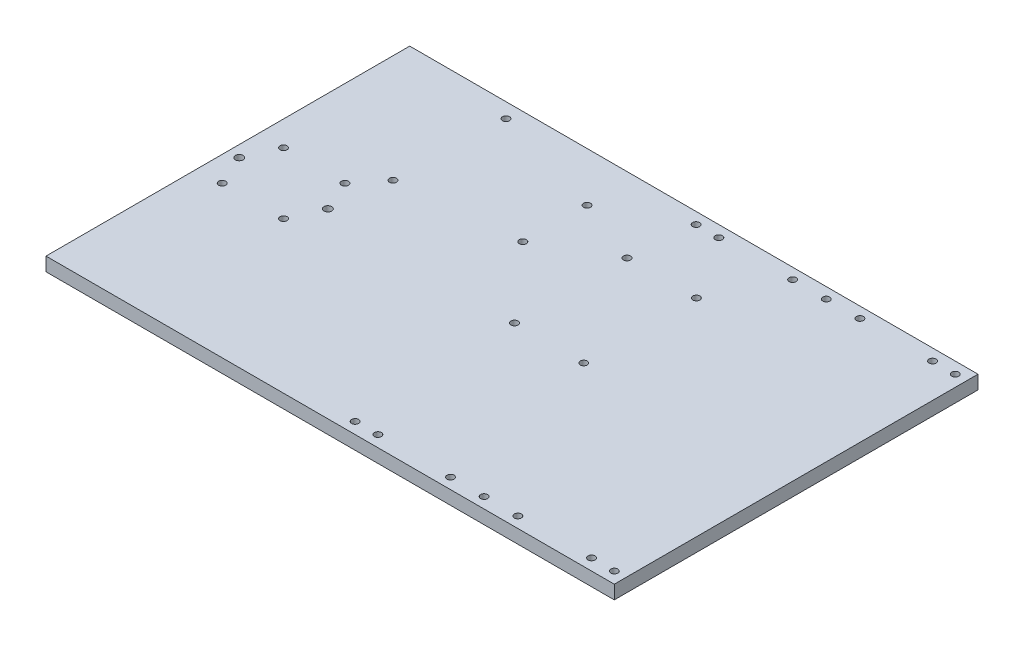
ISO-10303-21;
HEADER;
FILE_DESCRIPTION(('STEP AP214'),'2;1');
FILE_NAME('part.step','',(''),(''),'','','');
FILE_SCHEMA(('AUTOMOTIVE_DESIGN { 1 0 10303 214 1 1 1 1 }'));
ENDSEC;
DATA;
#1=APPLICATION_CONTEXT('core data for automotive mechanical design processes');
#2=APPLICATION_PROTOCOL_DEFINITION('international standard','automotive_design',2000,#1);
#3=PRODUCT_CONTEXT('',#1,'mechanical');
#4=PRODUCT('Part','Part','',(#3));
#5=PRODUCT_RELATED_PRODUCT_CATEGORY('part','',(#4));
#6=PRODUCT_DEFINITION_FORMATION('','',#4);
#7=PRODUCT_DEFINITION_CONTEXT('part definition',#1,'design');
#8=PRODUCT_DEFINITION('design','',#6,#7);
#9=PRODUCT_DEFINITION_SHAPE('','',#8);
#10=(LENGTH_UNIT() NAMED_UNIT(*) SI_UNIT(.MILLI.,.METRE.));
#11=(NAMED_UNIT(*) PLANE_ANGLE_UNIT() SI_UNIT($,.RADIAN.));
#12=(NAMED_UNIT(*) SI_UNIT($,.STERADIAN.) SOLID_ANGLE_UNIT());
#13=UNCERTAINTY_MEASURE_WITH_UNIT(LENGTH_MEASURE(1.E-05),#10,'distance_accuracy_value','');
#14=(GEOMETRIC_REPRESENTATION_CONTEXT(3) GLOBAL_UNCERTAINTY_ASSIGNED_CONTEXT((#13)) GLOBAL_UNIT_ASSIGNED_CONTEXT((#10,
#11,#12)) REPRESENTATION_CONTEXT('',''));
#15=CARTESIAN_POINT('',(0.,0.,0.));
#16=DIRECTION('',(0.,0.,1.));
#17=DIRECTION('',(1.,0.,0.));
#18=AXIS2_PLACEMENT_3D('',#15,#16,#17);
#19=CARTESIAN_POINT('',(0.,0.,0.));
#20=DIRECTION('',(0.,-1.,0.));
#21=DIRECTION('',(0.,0.,-1.));
#22=AXIS2_PLACEMENT_3D('',#19,#20,#21);
#23=PLANE('',#22);
#24=CARTESIAN_POINT('',(-80.9999999999999,0.,8.2572837456496E-13));
#25=DIRECTION('',(0.,-1.,0.));
#26=DIRECTION('',(0.,0.,-1.));
#27=AXIS2_PLACEMENT_3D('',#24,#25,#26);
#28=CIRCLE('',#27,1.69999999999999);
#29=CARTESIAN_POINT('',(-80.9999999999999,0.,-1.69999999999917));
#30=VERTEX_POINT('',#29);
#31=EDGE_CURVE('E275',#30,#30,#28,.T.);
#32=ORIENTED_EDGE('',*,*,#31,.F.);
#33=EDGE_LOOP('',(#32));
#34=FACE_BOUND('',#33,.T.);
#35=CARTESIAN_POINT('',(-120.,0.,9.64506252643105E-13));
#36=DIRECTION('',(0.,-1.,0.));
#37=DIRECTION('',(0.,0.,-1.));
#38=AXIS2_PLACEMENT_3D('',#35,#36,#37);
#39=CIRCLE('',#38,1.69999999999999);
#40=CARTESIAN_POINT('',(-120.,0.,-1.69999999999903));
#41=VERTEX_POINT('',#40);
#42=EDGE_CURVE('E269',#41,#41,#39,.T.);
#43=ORIENTED_EDGE('',*,*,#42,.F.);
#44=EDGE_LOOP('',(#43));
#45=FACE_BOUND('',#44,.T.);
#46=CARTESIAN_POINT('',(3.53999999999995,0.,2.46000000000128));
#47=DIRECTION('',(0.,1.,0.));
#48=DIRECTION('',(0.,0.,1.));
#49=AXIS2_PLACEMENT_3D('',#46,#47,#48);
#50=CIRCLE('',#49,1.55);
#51=CARTESIAN_POINT('',(3.53999999999995,0.,4.01000000000128));
#52=VERTEX_POINT('',#51);
#53=EDGE_CURVE('E260',#52,#52,#50,.T.);
#54=ORIENTED_EDGE('',*,*,#53,.T.);
#55=EDGE_LOOP('',(#54));
#56=FACE_BOUND('',#55,.T.);
#57=CARTESIAN_POINT('',(34.02,0.,2.46000000000127));
#58=DIRECTION('',(0.,1.,0.));
#59=DIRECTION('',(0.,0.,1.));
#60=AXIS2_PLACEMENT_3D('',#57,#58,#59);
#61=CIRCLE('',#60,1.55);
#62=CARTESIAN_POINT('',(34.02,0.,4.01000000000127));
#63=VERTEX_POINT('',#62);
#64=EDGE_CURVE('E254',#63,#63,#61,.T.);
#65=ORIENTED_EDGE('',*,*,#64,.T.);
#66=EDGE_LOOP('',(#65));
#67=FACE_BOUND('',#66,.T.);
#68=CARTESIAN_POINT('',(34.0199999999999,0.,-47.0699999999987));
#69=DIRECTION('',(0.,1.,0.));
#70=DIRECTION('',(0.,0.,1.));
#71=AXIS2_PLACEMENT_3D('',#68,#69,#70);
#72=CIRCLE('',#71,1.55);
#73=CARTESIAN_POINT('',(34.0199999999999,0.,-45.5199999999987));
#74=VERTEX_POINT('',#73);
#75=EDGE_CURVE('E248',#74,#74,#72,.T.);
#76=ORIENTED_EDGE('',*,*,#75,.T.);
#77=EDGE_LOOP('',(#76));
#78=FACE_BOUND('',#77,.T.);
#79=CARTESIAN_POINT('',(3.53999999999995,0.,-47.0699999999987));
#80=DIRECTION('',(0.,1.,0.));
#81=DIRECTION('',(0.,0.,1.));
#82=AXIS2_PLACEMENT_3D('',#79,#80,#81);
#83=CIRCLE('',#82,1.55);
#84=CARTESIAN_POINT('',(3.53999999999995,0.,-45.5199999999987));
#85=VERTEX_POINT('',#84);
#86=EDGE_CURVE('E242',#85,#85,#83,.T.);
#87=ORIENTED_EDGE('',*,*,#86,.T.);
#88=EDGE_LOOP('',(#87));
#89=FACE_BOUND('',#88,.T.);
#90=CARTESIAN_POINT('',(-77.56,0.,-25.209));
#91=DIRECTION('',(0.,1.,0.));
#92=DIRECTION('',(0.,0.,1.));
#93=AXIS2_PLACEMENT_3D('',#90,#91,#92);
#94=CIRCLE('',#93,1.55);
#95=CARTESIAN_POINT('',(-77.56,0.,-23.659));
#96=VERTEX_POINT('',#95);
#97=EDGE_CURVE('E236',#96,#96,#94,.T.);
#98=ORIENTED_EDGE('',*,*,#97,.T.);
#99=EDGE_LOOP('',(#98));
#100=FACE_BOUND('',#99,.T.);
#101=CARTESIAN_POINT('',(-25.5900000000001,0.,-30.359));
#102=DIRECTION('',(0.,1.,0.));
#103=DIRECTION('',(0.,0.,1.));
#104=AXIS2_PLACEMENT_3D('',#101,#102,#103);
#105=CIRCLE('',#104,1.55);
#106=CARTESIAN_POINT('',(-25.5900000000001,0.,-28.809));
#107=VERTEX_POINT('',#106);
#108=EDGE_CURVE('E230',#107,#107,#105,.T.);
#109=ORIENTED_EDGE('',*,*,#108,.T.);
#110=EDGE_LOOP('',(#109));
#111=FACE_BOUND('',#110,.T.);
#112=CARTESIAN_POINT('',(-25.36,0.,-58.359));
#113=DIRECTION('',(0.,1.,0.));
#114=DIRECTION('',(0.,0.,1.));
#115=AXIS2_PLACEMENT_3D('',#112,#113,#114);
#116=CIRCLE('',#115,1.55);
#117=CARTESIAN_POINT('',(-25.36,0.,-56.809));
#118=VERTEX_POINT('',#117);
#119=EDGE_CURVE('E224',#118,#118,#116,.T.);
#120=ORIENTED_EDGE('',*,*,#119,.T.);
#121=EDGE_LOOP('',(#120));
#122=FACE_BOUND('',#121,.T.);
#123=CARTESIAN_POINT('',(-76.16,0.,-73.509));
#124=DIRECTION('',(0.,1.,0.));
#125=DIRECTION('',(0.,0.,1.));
#126=AXIS2_PLACEMENT_3D('',#123,#124,#125);
#127=CIRCLE('',#126,1.55);
#128=CARTESIAN_POINT('',(-76.16,0.,-71.959));
#129=VERTEX_POINT('',#128);
#130=EDGE_CURVE('E218',#129,#129,#127,.T.);
#131=ORIENTED_EDGE('',*,*,#130,.T.);
#132=EDGE_LOOP('',(#131));
#133=FACE_BOUND('',#132,.T.);
#134=CARTESIAN_POINT('',(-114.,0.,13.5000000000009));
#135=DIRECTION('',(0.,1.,0.));
#136=DIRECTION('',(0.,0.,1.));
#137=AXIS2_PLACEMENT_3D('',#134,#135,#136);
#138=CIRCLE('',#137,1.55);
#139=CARTESIAN_POINT('',(-114.,0.,15.0500000000009));
#140=VERTEX_POINT('',#139);
#141=EDGE_CURVE('E212',#140,#140,#138,.T.);
#142=ORIENTED_EDGE('',*,*,#141,.T.);
#143=EDGE_LOOP('',(#142));
#144=FACE_BOUND('',#143,.T.);
#145=CARTESIAN_POINT('',(-86.9999999999999,0.,13.5000000000009));
#146=DIRECTION('',(0.,1.,0.));
#147=DIRECTION('',(0.,0.,1.));
#148=AXIS2_PLACEMENT_3D('',#145,#146,#147);
#149=CIRCLE('',#148,1.55);
#150=CARTESIAN_POINT('',(-86.9999999999999,0.,15.0500000000009));
#151=VERTEX_POINT('',#150);
#152=EDGE_CURVE('E206',#151,#151,#149,.T.);
#153=ORIENTED_EDGE('',*,*,#152,.T.);
#154=EDGE_LOOP('',(#153));
#155=FACE_BOUND('',#154,.T.);
#156=CARTESIAN_POINT('',(-86.9999999999999,0.,-13.4999999999992));
#157=DIRECTION('',(0.,1.,0.));
#158=DIRECTION('',(0.,0.,1.));
#159=AXIS2_PLACEMENT_3D('',#156,#157,#158);
#160=CIRCLE('',#159,1.55);
#161=CARTESIAN_POINT('',(-86.9999999999999,0.,-11.9499999999992));
#162=VERTEX_POINT('',#161);
#163=EDGE_CURVE('E200',#162,#162,#160,.T.);
#164=ORIENTED_EDGE('',*,*,#163,.T.);
#165=EDGE_LOOP('',(#164));
#166=FACE_BOUND('',#165,.T.);
#167=DIRECTION('',(0.,0.,-1.));
#168=VECTOR('',#167,1.);
#169=CARTESIAN_POINT('',(125.,0.,80.));
#170=LINE('',#169,#168);
#171=CARTESIAN_POINT('',(125.,0.,80.));
#172=VERTEX_POINT('',#171);
#173=CARTESIAN_POINT('',(125.,0.,-80.));
#174=VERTEX_POINT('',#173);
#175=EDGE_CURVE('E97',#172,#174,#170,.T.);
#176=ORIENTED_EDGE('',*,*,#175,.F.);
#177=DIRECTION('',(1.,0.,0.));
#178=VECTOR('',#177,1.);
#179=CARTESIAN_POINT('',(-125.,0.,80.));
#180=LINE('',#179,#178);
#181=CARTESIAN_POINT('',(-125.,0.,80.));
#182=VERTEX_POINT('',#181);
#183=EDGE_CURVE('E73',#182,#172,#180,.T.);
#184=ORIENTED_EDGE('',*,*,#183,.F.);
#185=DIRECTION('',(0.,0.,1.));
#186=VECTOR('',#185,1.);
#187=CARTESIAN_POINT('',(-125.,0.,80.));
#188=LINE('',#187,#186);
#189=CARTESIAN_POINT('',(-125.,0.,-80.));
#190=VERTEX_POINT('',#189);
#191=EDGE_CURVE('E67',#190,#182,#188,.T.);
#192=ORIENTED_EDGE('',*,*,#191,.F.);
#193=DIRECTION('',(-1.,0.,0.));
#194=VECTOR('',#193,1.);
#195=CARTESIAN_POINT('',(-125.,0.,-80.));
#196=LINE('',#195,#194);
#197=EDGE_CURVE('E89',#174,#190,#196,.T.);
#198=ORIENTED_EDGE('',*,*,#197,.F.);
#199=EDGE_LOOP('',(#176,#184,#192,#198));
#200=FACE_BOUND('',#199,.T.);
#201=CARTESIAN_POINT('',(5.99999999991924,0.,-75.0000000000015));
#202=DIRECTION('',(0.,1.,0.));
#203=DIRECTION('',(0.,0.,1.));
#204=AXIS2_PLACEMENT_3D('',#201,#202,#203);
#205=CIRCLE('',#204,1.55);
#206=CARTESIAN_POINT('',(5.99999999991924,0.,-73.4500000000015));
#207=VERTEX_POINT('',#206);
#208=EDGE_CURVE('E100',#207,#207,#205,.T.);
#209=ORIENTED_EDGE('',*,*,#208,.T.);
#210=EDGE_LOOP('',(#209));
#211=FACE_BOUND('',#210,.T.);
#212=CARTESIAN_POINT('',(15.9999999999192,0.,-75.0000000000015));
#213=DIRECTION('',(0.,1.,0.));
#214=DIRECTION('',(0.,0.,1.));
#215=AXIS2_PLACEMENT_3D('',#212,#213,#214);
#216=CIRCLE('',#215,1.55);
#217=CARTESIAN_POINT('',(15.9999999999192,0.,-73.4500000000015));
#218=VERTEX_POINT('',#217);
#219=EDGE_CURVE('E116',#218,#218,#216,.T.);
#220=ORIENTED_EDGE('',*,*,#219,.T.);
#221=EDGE_LOOP('',(#220));
#222=FACE_BOUND('',#221,.T.);
#223=CARTESIAN_POINT('',(110.,0.,-75.0000000000015));
#224=DIRECTION('',(0.,1.,0.));
#225=DIRECTION('',(0.,0.,1.));
#226=AXIS2_PLACEMENT_3D('',#223,#224,#225);
#227=CIRCLE('',#226,1.55);
#228=CARTESIAN_POINT('',(110.,0.,-73.4500000000015));
#229=VERTEX_POINT('',#228);
#230=EDGE_CURVE('E122',#229,#229,#227,.T.);
#231=ORIENTED_EDGE('',*,*,#230,.T.);
#232=EDGE_LOOP('',(#231));
#233=FACE_BOUND('',#232,.T.);
#234=CARTESIAN_POINT('',(120.,0.,-75.0000000000015));
#235=DIRECTION('',(0.,1.,0.));
#236=DIRECTION('',(0.,0.,1.));
#237=AXIS2_PLACEMENT_3D('',#234,#235,#236);
#238=CIRCLE('',#237,1.55);
#239=CARTESIAN_POINT('',(120.,0.,-73.4500000000015));
#240=VERTEX_POINT('',#239);
#241=EDGE_CURVE('E128',#240,#240,#238,.T.);
#242=ORIENTED_EDGE('',*,*,#241,.T.);
#243=EDGE_LOOP('',(#242));
#244=FACE_BOUND('',#243,.T.);
#245=CARTESIAN_POINT('',(120.,0.,75.));
#246=DIRECTION('',(0.,1.,0.));
#247=DIRECTION('',(0.,0.,1.));
#248=AXIS2_PLACEMENT_3D('',#245,#246,#247);
#249=CIRCLE('',#248,1.55);
#250=CARTESIAN_POINT('',(120.,0.,76.55));
#251=VERTEX_POINT('',#250);
#252=EDGE_CURVE('E134',#251,#251,#249,.T.);
#253=ORIENTED_EDGE('',*,*,#252,.T.);
#254=EDGE_LOOP('',(#253));
#255=FACE_BOUND('',#254,.T.);
#256=CARTESIAN_POINT('',(110.,0.,75.));
#257=DIRECTION('',(0.,1.,0.));
#258=DIRECTION('',(0.,0.,1.));
#259=AXIS2_PLACEMENT_3D('',#256,#257,#258);
#260=CIRCLE('',#259,1.55);
#261=CARTESIAN_POINT('',(110.,0.,76.55));
#262=VERTEX_POINT('',#261);
#263=EDGE_CURVE('E140',#262,#262,#260,.T.);
#264=ORIENTED_EDGE('',*,*,#263,.T.);
#265=EDGE_LOOP('',(#264));
#266=FACE_BOUND('',#265,.T.);
#267=CARTESIAN_POINT('',(15.9999999999192,0.,75.));
#268=DIRECTION('',(0.,1.,0.));
#269=DIRECTION('',(0.,0.,1.));
#270=AXIS2_PLACEMENT_3D('',#267,#268,#269);
#271=CIRCLE('',#270,1.55);
#272=CARTESIAN_POINT('',(15.9999999999192,0.,76.55));
#273=VERTEX_POINT('',#272);
#274=EDGE_CURVE('E146',#273,#273,#271,.T.);
#275=ORIENTED_EDGE('',*,*,#274,.T.);
#276=EDGE_LOOP('',(#275));
#277=FACE_BOUND('',#276,.T.);
#278=CARTESIAN_POINT('',(5.99999999991921,0.,75.));
#279=DIRECTION('',(0.,1.,0.));
#280=DIRECTION('',(0.,0.,1.));
#281=AXIS2_PLACEMENT_3D('',#278,#279,#280);
#282=CIRCLE('',#281,1.55);
#283=CARTESIAN_POINT('',(5.99999999991921,0.,76.55));
#284=VERTEX_POINT('',#283);
#285=EDGE_CURVE('E152',#284,#284,#282,.T.);
#286=ORIENTED_EDGE('',*,*,#285,.T.);
#287=EDGE_LOOP('',(#286));
#288=FACE_BOUND('',#287,.T.);
#289=CARTESIAN_POINT('',(77.7999999999992,0.,75.2499999999985));
#290=DIRECTION('',(0.,1.,0.));
#291=DIRECTION('',(0.,0.,1.));
#292=AXIS2_PLACEMENT_3D('',#289,#290,#291);
#293=CIRCLE('',#292,1.55);
#294=CARTESIAN_POINT('',(77.7999999999992,0.,76.7999999999984));
#295=VERTEX_POINT('',#294);
#296=EDGE_CURVE('E158',#295,#295,#293,.T.);
#297=ORIENTED_EDGE('',*,*,#296,.T.);
#298=EDGE_LOOP('',(#297));
#299=FACE_BOUND('',#298,.T.);
#300=CARTESIAN_POINT('',(62.9999999999999,0.,75.25));
#301=DIRECTION('',(0.,1.,0.));
#302=DIRECTION('',(0.,0.,1.));
#303=AXIS2_PLACEMENT_3D('',#300,#301,#302);
#304=CIRCLE('',#303,1.55);
#305=CARTESIAN_POINT('',(62.9999999999999,0.,76.8));
#306=VERTEX_POINT('',#305);
#307=EDGE_CURVE('E164',#306,#306,#304,.T.);
#308=ORIENTED_EDGE('',*,*,#307,.T.);
#309=EDGE_LOOP('',(#308));
#310=FACE_BOUND('',#309,.T.);
#311=CARTESIAN_POINT('',(48.1999999999999,0.,75.25));
#312=DIRECTION('',(0.,1.,0.));
#313=DIRECTION('',(0.,0.,1.));
#314=AXIS2_PLACEMENT_3D('',#311,#312,#313);
#315=CIRCLE('',#314,1.55);
#316=CARTESIAN_POINT('',(48.1999999999999,0.,76.8));
#317=VERTEX_POINT('',#316);
#318=EDGE_CURVE('E170',#317,#317,#315,.T.);
#319=ORIENTED_EDGE('',*,*,#318,.T.);
#320=EDGE_LOOP('',(#319));
#321=FACE_BOUND('',#320,.T.);
#322=CARTESIAN_POINT('',(77.7999995403885,0.,-75.2500014025759));
#323=DIRECTION('',(0.,1.,0.));
#324=DIRECTION('',(0.,0.,1.));
#325=AXIS2_PLACEMENT_3D('',#322,#323,#324);
#326=CIRCLE('',#325,1.55);
#327=CARTESIAN_POINT('',(77.7999995403885,0.,-73.7000014025759));
#328=VERTEX_POINT('',#327);
#329=EDGE_CURVE('E176',#328,#328,#326,.T.);
#330=ORIENTED_EDGE('',*,*,#329,.T.);
#331=EDGE_LOOP('',(#330));
#332=FACE_BOUND('',#331,.T.);
#333=CARTESIAN_POINT('',(62.9999995403885,0.,-75.2500014025759));
#334=DIRECTION('',(0.,1.,0.));
#335=DIRECTION('',(0.,0.,1.));
#336=AXIS2_PLACEMENT_3D('',#333,#334,#335);
#337=CIRCLE('',#336,1.55);
#338=CARTESIAN_POINT('',(62.9999995403885,0.,-73.7000014025759));
#339=VERTEX_POINT('',#338);
#340=EDGE_CURVE('E182',#339,#339,#337,.T.);
#341=ORIENTED_EDGE('',*,*,#340,.T.);
#342=EDGE_LOOP('',(#341));
#343=FACE_BOUND('',#342,.T.);
#344=CARTESIAN_POINT('',(48.1999995403885,0.,-75.2500014025759));
#345=DIRECTION('',(0.,1.,0.));
#346=DIRECTION('',(0.,0.,1.));
#347=AXIS2_PLACEMENT_3D('',#344,#345,#346);
#348=CIRCLE('',#347,1.55);
#349=CARTESIAN_POINT('',(48.1999995403885,0.,-73.7000014025759));
#350=VERTEX_POINT('',#349);
#351=EDGE_CURVE('E188',#350,#350,#348,.T.);
#352=ORIENTED_EDGE('',*,*,#351,.T.);
#353=EDGE_LOOP('',(#352));
#354=FACE_BOUND('',#353,.T.);
#355=CARTESIAN_POINT('',(-114.,0.,-13.4999999999992));
#356=DIRECTION('',(0.,1.,0.));
#357=DIRECTION('',(0.,0.,1.));
#358=AXIS2_PLACEMENT_3D('',#355,#356,#357);
#359=CIRCLE('',#358,1.55);
#360=CARTESIAN_POINT('',(-114.,0.,-11.9499999999992));
#361=VERTEX_POINT('',#360);
#362=EDGE_CURVE('E194',#361,#361,#359,.T.);
#363=ORIENTED_EDGE('',*,*,#362,.T.);
#364=EDGE_LOOP('',(#363));
#365=FACE_BOUND('',#364,.T.);
#366=ADVANCED_FACE('F33',(#34,#45,#56,#67,#78,#89,#100,#111,#122,#133,#144,#155,#166,#200,#211,
#222,#233,#244,#255,#266,#277,#288,#299,#310,#321,#332,#343,#354,#365),#23,.T.);
#367=CARTESIAN_POINT('',(125.,6.,80.));
#368=DIRECTION('',(-1.,0.,0.));
#369=DIRECTION('',(0.,0.,1.));
#370=AXIS2_PLACEMENT_3D('',#367,#368,#369);
#371=PLANE('',#370);
#372=ORIENTED_EDGE('',*,*,#175,.T.);
#373=DIRECTION('',(0.,-1.,0.));
#374=VECTOR('',#373,1.);
#375=CARTESIAN_POINT('',(125.,6.,-80.));
#376=LINE('',#375,#374);
#377=CARTESIAN_POINT('',(125.,6.,-80.));
#378=VERTEX_POINT('',#377);
#379=EDGE_CURVE('E11',#378,#174,#376,.T.);
#380=ORIENTED_EDGE('',*,*,#379,.F.);
#381=DIRECTION('',(0.,0.,-1.));
#382=VECTOR('',#381,1.);
#383=CARTESIAN_POINT('',(125.,6.,80.));
#384=LINE('',#383,#382);
#385=CARTESIAN_POINT('',(125.,6.,80.));
#386=VERTEX_POINT('',#385);
#387=EDGE_CURVE('E85',#386,#378,#384,.T.);
#388=ORIENTED_EDGE('',*,*,#387,.F.);
#389=DIRECTION('',(0.,-1.,0.));
#390=VECTOR('',#389,1.);
#391=CARTESIAN_POINT('',(125.,6.,80.));
#392=LINE('',#391,#390);
#393=EDGE_CURVE('E93',#386,#172,#392,.T.);
#394=ORIENTED_EDGE('',*,*,#393,.T.);
#395=EDGE_LOOP('',(#372,#380,#388,#394));
#396=FACE_BOUND('',#395,.T.);
#397=ADVANCED_FACE('F35',(#396),#371,.F.);
#398=CARTESIAN_POINT('',(-125.,6.,-80.));
#399=DIRECTION('',(0.,0.,1.));
#400=DIRECTION('',(1.,0.,0.));
#401=AXIS2_PLACEMENT_3D('',#398,#399,#400);
#402=PLANE('',#401);
#403=ORIENTED_EDGE('',*,*,#197,.T.);
#404=DIRECTION('',(0.,-1.,0.));
#405=VECTOR('',#404,1.);
#406=CARTESIAN_POINT('',(-125.,6.,-80.));
#407=LINE('',#406,#405);
#408=CARTESIAN_POINT('',(-125.,6.,-80.));
#409=VERTEX_POINT('',#408);
#410=EDGE_CURVE('E42',#409,#190,#407,.T.);
#411=ORIENTED_EDGE('',*,*,#410,.F.);
#412=DIRECTION('',(-1.,0.,0.));
#413=VECTOR('',#412,1.);
#414=CARTESIAN_POINT('',(-125.,6.,-80.));
#415=LINE('',#414,#413);
#416=EDGE_CURVE('E80',#378,#409,#415,.T.);
#417=ORIENTED_EDGE('',*,*,#416,.F.);
#418=ORIENTED_EDGE('',*,*,#379,.T.);
#419=EDGE_LOOP('',(#403,#411,#417,#418));
#420=FACE_BOUND('',#419,.T.);
#421=ADVANCED_FACE('F88',(#420),#402,.F.);
#422=CARTESIAN_POINT('',(-125.,6.,80.));
#423=DIRECTION('',(1.,0.,0.));
#424=DIRECTION('',(0.,0.,-1.));
#425=AXIS2_PLACEMENT_3D('',#422,#423,#424);
#426=PLANE('',#425);
#427=ORIENTED_EDGE('',*,*,#191,.T.);
#428=DIRECTION('',(0.,-1.,0.));
#429=VECTOR('',#428,1.);
#430=CARTESIAN_POINT('',(-125.,6.,80.));
#431=LINE('',#430,#429);
#432=CARTESIAN_POINT('',(-125.,6.,80.));
#433=VERTEX_POINT('',#432);
#434=EDGE_CURVE('E90',#433,#182,#431,.T.);
#435=ORIENTED_EDGE('',*,*,#434,.F.);
#436=DIRECTION('',(0.,0.,1.));
#437=VECTOR('',#436,1.);
#438=CARTESIAN_POINT('',(-125.,6.,80.));
#439=LINE('',#438,#437);
#440=EDGE_CURVE('E83',#409,#433,#439,.T.);
#441=ORIENTED_EDGE('',*,*,#440,.F.);
#442=ORIENTED_EDGE('',*,*,#410,.T.);
#443=EDGE_LOOP('',(#427,#435,#441,#442));
#444=FACE_BOUND('',#443,.T.);
#445=ADVANCED_FACE('F91',(#444),#426,.F.);
#446=CARTESIAN_POINT('',(-125.,6.,80.));
#447=DIRECTION('',(0.,0.,-1.));
#448=DIRECTION('',(-1.,0.,0.));
#449=AXIS2_PLACEMENT_3D('',#446,#447,#448);
#450=PLANE('',#449);
#451=ORIENTED_EDGE('',*,*,#183,.T.);
#452=ORIENTED_EDGE('',*,*,#393,.F.);
#453=DIRECTION('',(1.,0.,0.));
#454=VECTOR('',#453,1.);
#455=CARTESIAN_POINT('',(-125.,6.,80.));
#456=LINE('',#455,#454);
#457=EDGE_CURVE('E50',#433,#386,#456,.T.);
#458=ORIENTED_EDGE('',*,*,#457,.F.);
#459=ORIENTED_EDGE('',*,*,#434,.T.);
#460=EDGE_LOOP('',(#451,#452,#458,#459));
#461=FACE_BOUND('',#460,.T.);
#462=ADVANCED_FACE('F105',(#461),#450,.F.);
#463=CARTESIAN_POINT('',(0.,6.,0.));
#464=DIRECTION('',(0.,-1.,0.));
#465=DIRECTION('',(0.,0.,-1.));
#466=AXIS2_PLACEMENT_3D('',#463,#464,#465);
#467=PLANE('',#466);
#468=CARTESIAN_POINT('',(-80.9999999999999,6.00000000000001,8.2572837456496E-13));
#469=DIRECTION('',(0.,-1.,0.));
#470=DIRECTION('',(0.,0.,-1.));
#471=AXIS2_PLACEMENT_3D('',#468,#469,#470);
#472=CIRCLE('',#471,1.69999999999999);
#473=CARTESIAN_POINT('',(-80.9999999999999,6.00000000000001,-1.69999999999917));
#474=VERTEX_POINT('',#473);
#475=EDGE_CURVE('E272',#474,#474,#472,.T.);
#476=ORIENTED_EDGE('',*,*,#475,.T.);
#477=EDGE_LOOP('',(#476));
#478=FACE_BOUND('',#477,.T.);
#479=CARTESIAN_POINT('',(-120.,6.00000000000001,9.64506252643105E-13));
#480=DIRECTION('',(0.,-1.,0.));
#481=DIRECTION('',(0.,0.,-1.));
#482=AXIS2_PLACEMENT_3D('',#479,#480,#481);
#483=CIRCLE('',#482,1.69999999999999);
#484=CARTESIAN_POINT('',(-120.,6.00000000000001,-1.69999999999903));
#485=VERTEX_POINT('',#484);
#486=EDGE_CURVE('E266',#485,#485,#483,.T.);
#487=ORIENTED_EDGE('',*,*,#486,.T.);
#488=EDGE_LOOP('',(#487));
#489=FACE_BOUND('',#488,.T.);
#490=CARTESIAN_POINT('',(3.53999999999995,6.,2.46000000000128));
#491=DIRECTION('',(0.,1.,0.));
#492=DIRECTION('',(0.,0.,1.));
#493=AXIS2_PLACEMENT_3D('',#490,#491,#492);
#494=CIRCLE('',#493,1.55);
#495=CARTESIAN_POINT('',(3.53999999999995,6.,4.01000000000128));
#496=VERTEX_POINT('',#495);
#497=EDGE_CURVE('E263',#496,#496,#494,.T.);
#498=ORIENTED_EDGE('',*,*,#497,.F.);
#499=EDGE_LOOP('',(#498));
#500=FACE_BOUND('',#499,.T.);
#501=CARTESIAN_POINT('',(34.02,6.,2.46000000000127));
#502=DIRECTION('',(0.,1.,0.));
#503=DIRECTION('',(0.,0.,1.));
#504=AXIS2_PLACEMENT_3D('',#501,#502,#503);
#505=CIRCLE('',#504,1.55);
#506=CARTESIAN_POINT('',(34.02,6.,4.01000000000127));
#507=VERTEX_POINT('',#506);
#508=EDGE_CURVE('E257',#507,#507,#505,.T.);
#509=ORIENTED_EDGE('',*,*,#508,.F.);
#510=EDGE_LOOP('',(#509));
#511=FACE_BOUND('',#510,.T.);
#512=CARTESIAN_POINT('',(34.0199999999999,6.,-47.0699999999987));
#513=DIRECTION('',(0.,1.,0.));
#514=DIRECTION('',(0.,0.,1.));
#515=AXIS2_PLACEMENT_3D('',#512,#513,#514);
#516=CIRCLE('',#515,1.55);
#517=CARTESIAN_POINT('',(34.0199999999999,6.,-45.5199999999987));
#518=VERTEX_POINT('',#517);
#519=EDGE_CURVE('E251',#518,#518,#516,.T.);
#520=ORIENTED_EDGE('',*,*,#519,.F.);
#521=EDGE_LOOP('',(#520));
#522=FACE_BOUND('',#521,.T.);
#523=CARTESIAN_POINT('',(3.53999999999995,6.,-47.0699999999987));
#524=DIRECTION('',(0.,1.,0.));
#525=DIRECTION('',(0.,0.,1.));
#526=AXIS2_PLACEMENT_3D('',#523,#524,#525);
#527=CIRCLE('',#526,1.55);
#528=CARTESIAN_POINT('',(3.53999999999995,6.,-45.5199999999987));
#529=VERTEX_POINT('',#528);
#530=EDGE_CURVE('E245',#529,#529,#527,.T.);
#531=ORIENTED_EDGE('',*,*,#530,.F.);
#532=EDGE_LOOP('',(#531));
#533=FACE_BOUND('',#532,.T.);
#534=CARTESIAN_POINT('',(-77.56,6.,-25.209));
#535=DIRECTION('',(0.,1.,0.));
#536=DIRECTION('',(0.,0.,1.));
#537=AXIS2_PLACEMENT_3D('',#534,#535,#536);
#538=CIRCLE('',#537,1.55);
#539=CARTESIAN_POINT('',(-77.56,6.,-23.659));
#540=VERTEX_POINT('',#539);
#541=EDGE_CURVE('E239',#540,#540,#538,.T.);
#542=ORIENTED_EDGE('',*,*,#541,.F.);
#543=EDGE_LOOP('',(#542));
#544=FACE_BOUND('',#543,.T.);
#545=CARTESIAN_POINT('',(-25.5900000000001,6.,-30.359));
#546=DIRECTION('',(0.,1.,0.));
#547=DIRECTION('',(0.,0.,1.));
#548=AXIS2_PLACEMENT_3D('',#545,#546,#547);
#549=CIRCLE('',#548,1.55);
#550=CARTESIAN_POINT('',(-25.5900000000001,6.,-28.809));
#551=VERTEX_POINT('',#550);
#552=EDGE_CURVE('E233',#551,#551,#549,.T.);
#553=ORIENTED_EDGE('',*,*,#552,.F.);
#554=EDGE_LOOP('',(#553));
#555=FACE_BOUND('',#554,.T.);
#556=CARTESIAN_POINT('',(-25.36,6.,-58.359));
#557=DIRECTION('',(0.,1.,0.));
#558=DIRECTION('',(0.,0.,1.));
#559=AXIS2_PLACEMENT_3D('',#556,#557,#558);
#560=CIRCLE('',#559,1.55);
#561=CARTESIAN_POINT('',(-25.36,6.,-56.809));
#562=VERTEX_POINT('',#561);
#563=EDGE_CURVE('E227',#562,#562,#560,.T.);
#564=ORIENTED_EDGE('',*,*,#563,.F.);
#565=EDGE_LOOP('',(#564));
#566=FACE_BOUND('',#565,.T.);
#567=CARTESIAN_POINT('',(-76.16,6.,-73.509));
#568=DIRECTION('',(0.,1.,0.));
#569=DIRECTION('',(0.,0.,1.));
#570=AXIS2_PLACEMENT_3D('',#567,#568,#569);
#571=CIRCLE('',#570,1.55);
#572=CARTESIAN_POINT('',(-76.16,6.,-71.959));
#573=VERTEX_POINT('',#572);
#574=EDGE_CURVE('E221',#573,#573,#571,.T.);
#575=ORIENTED_EDGE('',*,*,#574,.F.);
#576=EDGE_LOOP('',(#575));
#577=FACE_BOUND('',#576,.T.);
#578=CARTESIAN_POINT('',(-114.,6.,13.5000000000009));
#579=DIRECTION('',(0.,1.,0.));
#580=DIRECTION('',(0.,0.,1.));
#581=AXIS2_PLACEMENT_3D('',#578,#579,#580);
#582=CIRCLE('',#581,1.55);
#583=CARTESIAN_POINT('',(-114.,6.,15.0500000000009));
#584=VERTEX_POINT('',#583);
#585=EDGE_CURVE('E215',#584,#584,#582,.T.);
#586=ORIENTED_EDGE('',*,*,#585,.F.);
#587=EDGE_LOOP('',(#586));
#588=FACE_BOUND('',#587,.T.);
#589=CARTESIAN_POINT('',(-86.9999999999999,6.,13.5000000000009));
#590=DIRECTION('',(0.,1.,0.));
#591=DIRECTION('',(0.,0.,1.));
#592=AXIS2_PLACEMENT_3D('',#589,#590,#591);
#593=CIRCLE('',#592,1.55);
#594=CARTESIAN_POINT('',(-86.9999999999999,6.,15.0500000000009));
#595=VERTEX_POINT('',#594);
#596=EDGE_CURVE('E209',#595,#595,#593,.T.);
#597=ORIENTED_EDGE('',*,*,#596,.F.);
#598=EDGE_LOOP('',(#597));
#599=FACE_BOUND('',#598,.T.);
#600=CARTESIAN_POINT('',(-86.9999999999999,6.,-13.4999999999992));
#601=DIRECTION('',(0.,1.,0.));
#602=DIRECTION('',(0.,0.,1.));
#603=AXIS2_PLACEMENT_3D('',#600,#601,#602);
#604=CIRCLE('',#603,1.55);
#605=CARTESIAN_POINT('',(-86.9999999999999,6.,-11.9499999999992));
#606=VERTEX_POINT('',#605);
#607=EDGE_CURVE('E203',#606,#606,#604,.T.);
#608=ORIENTED_EDGE('',*,*,#607,.F.);
#609=EDGE_LOOP('',(#608));
#610=FACE_BOUND('',#609,.T.);
#611=CARTESIAN_POINT('',(-114.,6.,-13.4999999999992));
#612=DIRECTION('',(0.,1.,0.));
#613=DIRECTION('',(0.,0.,1.));
#614=AXIS2_PLACEMENT_3D('',#611,#612,#613);
#615=CIRCLE('',#614,1.55);
#616=CARTESIAN_POINT('',(-114.,6.,-11.9499999999992));
#617=VERTEX_POINT('',#616);
#618=EDGE_CURVE('E197',#617,#617,#615,.T.);
#619=ORIENTED_EDGE('',*,*,#618,.F.);
#620=EDGE_LOOP('',(#619));
#621=FACE_BOUND('',#620,.T.);
#622=CARTESIAN_POINT('',(48.1999995403885,6.,-75.2500014025759));
#623=DIRECTION('',(0.,1.,0.));
#624=DIRECTION('',(0.,0.,1.));
#625=AXIS2_PLACEMENT_3D('',#622,#623,#624);
#626=CIRCLE('',#625,1.55);
#627=CARTESIAN_POINT('',(48.1999995403885,6.,-73.7000014025759));
#628=VERTEX_POINT('',#627);
#629=EDGE_CURVE('E191',#628,#628,#626,.T.);
#630=ORIENTED_EDGE('',*,*,#629,.F.);
#631=EDGE_LOOP('',(#630));
#632=FACE_BOUND('',#631,.T.);
#633=CARTESIAN_POINT('',(62.9999995403885,6.,-75.2500014025759));
#634=DIRECTION('',(0.,1.,0.));
#635=DIRECTION('',(0.,0.,1.));
#636=AXIS2_PLACEMENT_3D('',#633,#634,#635);
#637=CIRCLE('',#636,1.55);
#638=CARTESIAN_POINT('',(62.9999995403885,6.,-73.7000014025759));
#639=VERTEX_POINT('',#638);
#640=EDGE_CURVE('E185',#639,#639,#637,.T.);
#641=ORIENTED_EDGE('',*,*,#640,.F.);
#642=EDGE_LOOP('',(#641));
#643=FACE_BOUND('',#642,.T.);
#644=CARTESIAN_POINT('',(77.7999995403885,6.,-75.2500014025759));
#645=DIRECTION('',(0.,1.,0.));
#646=DIRECTION('',(0.,0.,1.));
#647=AXIS2_PLACEMENT_3D('',#644,#645,#646);
#648=CIRCLE('',#647,1.55);
#649=CARTESIAN_POINT('',(77.7999995403885,6.,-73.7000014025759));
#650=VERTEX_POINT('',#649);
#651=EDGE_CURVE('E179',#650,#650,#648,.T.);
#652=ORIENTED_EDGE('',*,*,#651,.F.);
#653=EDGE_LOOP('',(#652));
#654=FACE_BOUND('',#653,.T.);
#655=CARTESIAN_POINT('',(48.1999999999999,6.,75.25));
#656=DIRECTION('',(0.,1.,0.));
#657=DIRECTION('',(0.,0.,1.));
#658=AXIS2_PLACEMENT_3D('',#655,#656,#657);
#659=CIRCLE('',#658,1.55);
#660=CARTESIAN_POINT('',(48.1999999999999,6.,76.8));
#661=VERTEX_POINT('',#660);
#662=EDGE_CURVE('E173',#661,#661,#659,.T.);
#663=ORIENTED_EDGE('',*,*,#662,.F.);
#664=EDGE_LOOP('',(#663));
#665=FACE_BOUND('',#664,.T.);
#666=CARTESIAN_POINT('',(62.9999999999999,6.,75.25));
#667=DIRECTION('',(0.,1.,0.));
#668=DIRECTION('',(0.,0.,1.));
#669=AXIS2_PLACEMENT_3D('',#666,#667,#668);
#670=CIRCLE('',#669,1.55);
#671=CARTESIAN_POINT('',(62.9999999999999,6.,76.8));
#672=VERTEX_POINT('',#671);
#673=EDGE_CURVE('E167',#672,#672,#670,.T.);
#674=ORIENTED_EDGE('',*,*,#673,.F.);
#675=EDGE_LOOP('',(#674));
#676=FACE_BOUND('',#675,.T.);
#677=CARTESIAN_POINT('',(77.7999999999992,6.,75.2499999999985));
#678=DIRECTION('',(0.,1.,0.));
#679=DIRECTION('',(0.,0.,1.));
#680=AXIS2_PLACEMENT_3D('',#677,#678,#679);
#681=CIRCLE('',#680,1.55);
#682=CARTESIAN_POINT('',(77.7999999999992,6.,76.7999999999984));
#683=VERTEX_POINT('',#682);
#684=EDGE_CURVE('E161',#683,#683,#681,.T.);
#685=ORIENTED_EDGE('',*,*,#684,.F.);
#686=EDGE_LOOP('',(#685));
#687=FACE_BOUND('',#686,.T.);
#688=CARTESIAN_POINT('',(5.99999999991921,6.,75.));
#689=DIRECTION('',(0.,1.,0.));
#690=DIRECTION('',(0.,0.,1.));
#691=AXIS2_PLACEMENT_3D('',#688,#689,#690);
#692=CIRCLE('',#691,1.55);
#693=CARTESIAN_POINT('',(5.99999999991921,6.,76.55));
#694=VERTEX_POINT('',#693);
#695=EDGE_CURVE('E155',#694,#694,#692,.T.);
#696=ORIENTED_EDGE('',*,*,#695,.F.);
#697=EDGE_LOOP('',(#696));
#698=FACE_BOUND('',#697,.T.);
#699=CARTESIAN_POINT('',(15.9999999999192,6.,75.));
#700=DIRECTION('',(0.,1.,0.));
#701=DIRECTION('',(0.,0.,1.));
#702=AXIS2_PLACEMENT_3D('',#699,#700,#701);
#703=CIRCLE('',#702,1.55);
#704=CARTESIAN_POINT('',(15.9999999999192,6.,76.55));
#705=VERTEX_POINT('',#704);
#706=EDGE_CURVE('E149',#705,#705,#703,.T.);
#707=ORIENTED_EDGE('',*,*,#706,.F.);
#708=EDGE_LOOP('',(#707));
#709=FACE_BOUND('',#708,.T.);
#710=CARTESIAN_POINT('',(110.,6.,75.));
#711=DIRECTION('',(0.,1.,0.));
#712=DIRECTION('',(0.,0.,1.));
#713=AXIS2_PLACEMENT_3D('',#710,#711,#712);
#714=CIRCLE('',#713,1.55);
#715=CARTESIAN_POINT('',(110.,6.,76.55));
#716=VERTEX_POINT('',#715);
#717=EDGE_CURVE('E143',#716,#716,#714,.T.);
#718=ORIENTED_EDGE('',*,*,#717,.F.);
#719=EDGE_LOOP('',(#718));
#720=FACE_BOUND('',#719,.T.);
#721=CARTESIAN_POINT('',(120.,6.,75.));
#722=DIRECTION('',(0.,1.,0.));
#723=DIRECTION('',(0.,0.,1.));
#724=AXIS2_PLACEMENT_3D('',#721,#722,#723);
#725=CIRCLE('',#724,1.55);
#726=CARTESIAN_POINT('',(120.,6.,76.55));
#727=VERTEX_POINT('',#726);
#728=EDGE_CURVE('E137',#727,#727,#725,.T.);
#729=ORIENTED_EDGE('',*,*,#728,.F.);
#730=EDGE_LOOP('',(#729));
#731=FACE_BOUND('',#730,.T.);
#732=CARTESIAN_POINT('',(120.,6.,-75.0000000000015));
#733=DIRECTION('',(0.,1.,0.));
#734=DIRECTION('',(0.,0.,1.));
#735=AXIS2_PLACEMENT_3D('',#732,#733,#734);
#736=CIRCLE('',#735,1.55);
#737=CARTESIAN_POINT('',(120.,6.,-73.4500000000015));
#738=VERTEX_POINT('',#737);
#739=EDGE_CURVE('E131',#738,#738,#736,.T.);
#740=ORIENTED_EDGE('',*,*,#739,.F.);
#741=EDGE_LOOP('',(#740));
#742=FACE_BOUND('',#741,.T.);
#743=CARTESIAN_POINT('',(110.,6.,-75.0000000000015));
#744=DIRECTION('',(0.,1.,0.));
#745=DIRECTION('',(0.,0.,1.));
#746=AXIS2_PLACEMENT_3D('',#743,#744,#745);
#747=CIRCLE('',#746,1.55);
#748=CARTESIAN_POINT('',(110.,6.,-73.4500000000015));
#749=VERTEX_POINT('',#748);
#750=EDGE_CURVE('E125',#749,#749,#747,.T.);
#751=ORIENTED_EDGE('',*,*,#750,.F.);
#752=EDGE_LOOP('',(#751));
#753=FACE_BOUND('',#752,.T.);
#754=CARTESIAN_POINT('',(15.9999999999192,6.,-75.0000000000015));
#755=DIRECTION('',(0.,1.,0.));
#756=DIRECTION('',(0.,0.,1.));
#757=AXIS2_PLACEMENT_3D('',#754,#755,#756);
#758=CIRCLE('',#757,1.55);
#759=CARTESIAN_POINT('',(15.9999999999192,6.,-73.4500000000015));
#760=VERTEX_POINT('',#759);
#761=EDGE_CURVE('E119',#760,#760,#758,.T.);
#762=ORIENTED_EDGE('',*,*,#761,.F.);
#763=EDGE_LOOP('',(#762));
#764=FACE_BOUND('',#763,.T.);
#765=CARTESIAN_POINT('',(5.99999999991924,6.,-75.0000000000015));
#766=DIRECTION('',(0.,1.,0.));
#767=DIRECTION('',(0.,0.,1.));
#768=AXIS2_PLACEMENT_3D('',#765,#766,#767);
#769=CIRCLE('',#768,1.55);
#770=CARTESIAN_POINT('',(5.99999999991924,6.,-73.4500000000015));
#771=VERTEX_POINT('',#770);
#772=EDGE_CURVE('E113',#771,#771,#769,.T.);
#773=ORIENTED_EDGE('',*,*,#772,.F.);
#774=EDGE_LOOP('',(#773));
#775=FACE_BOUND('',#774,.T.);
#776=ORIENTED_EDGE('',*,*,#387,.T.);
#777=ORIENTED_EDGE('',*,*,#416,.T.);
#778=ORIENTED_EDGE('',*,*,#440,.T.);
#779=ORIENTED_EDGE('',*,*,#457,.T.);
#780=EDGE_LOOP('',(#776,#777,#778,#779));
#781=FACE_BOUND('',#780,.T.);
#782=ADVANCED_FACE('F81',(#478,#489,#500,#511,#522,#533,#544,#555,#566,#577,#588,#599,#610,#621,
#632,#643,#654,#665,#676,#687,#698,#709,#720,#731,#742,#753,#764,#775,#781),#467,.F.);
#783=CARTESIAN_POINT('',(5.99999999991924,6.,-75.0000000000015));
#784=DIRECTION('',(0.,1.,0.));
#785=DIRECTION('',(0.,0.,1.));
#786=AXIS2_PLACEMENT_3D('',#783,#784,#785);
#787=CYLINDRICAL_SURFACE('',#786,1.55);
#788=ORIENTED_EDGE('',*,*,#208,.F.);
#789=EDGE_LOOP('',(#788));
#790=FACE_BOUND('',#789,.T.);
#791=ORIENTED_EDGE('',*,*,#772,.T.);
#792=EDGE_LOOP('',(#791));
#793=FACE_BOUND('',#792,.T.);
#794=ADVANCED_FACE('F318',(#790,#793),#787,.F.);
#795=CARTESIAN_POINT('',(15.9999999999192,6.,-75.0000000000015));
#796=DIRECTION('',(0.,1.,0.));
#797=DIRECTION('',(0.,0.,1.));
#798=AXIS2_PLACEMENT_3D('',#795,#796,#797);
#799=CYLINDRICAL_SURFACE('',#798,1.55);
#800=ORIENTED_EDGE('',*,*,#219,.F.);
#801=EDGE_LOOP('',(#800));
#802=FACE_BOUND('',#801,.T.);
#803=ORIENTED_EDGE('',*,*,#761,.T.);
#804=EDGE_LOOP('',(#803));
#805=FACE_BOUND('',#804,.T.);
#806=ADVANCED_FACE('F352',(#802,#805),#799,.F.);
#807=CARTESIAN_POINT('',(110.,6.,-75.0000000000015));
#808=DIRECTION('',(0.,1.,0.));
#809=DIRECTION('',(0.,0.,1.));
#810=AXIS2_PLACEMENT_3D('',#807,#808,#809);
#811=CYLINDRICAL_SURFACE('',#810,1.55);
#812=ORIENTED_EDGE('',*,*,#230,.F.);
#813=EDGE_LOOP('',(#812));
#814=FACE_BOUND('',#813,.T.);
#815=ORIENTED_EDGE('',*,*,#750,.T.);
#816=EDGE_LOOP('',(#815));
#817=FACE_BOUND('',#816,.T.);
#818=ADVANCED_FACE('F358',(#814,#817),#811,.F.);
#819=CARTESIAN_POINT('',(120.,6.,-75.0000000000015));
#820=DIRECTION('',(0.,1.,0.));
#821=DIRECTION('',(0.,0.,1.));
#822=AXIS2_PLACEMENT_3D('',#819,#820,#821);
#823=CYLINDRICAL_SURFACE('',#822,1.55);
#824=ORIENTED_EDGE('',*,*,#241,.F.);
#825=EDGE_LOOP('',(#824));
#826=FACE_BOUND('',#825,.T.);
#827=ORIENTED_EDGE('',*,*,#739,.T.);
#828=EDGE_LOOP('',(#827));
#829=FACE_BOUND('',#828,.T.);
#830=ADVANCED_FACE('F497',(#826,#829),#823,.F.);
#831=CARTESIAN_POINT('',(120.,6.,75.));
#832=DIRECTION('',(0.,1.,0.));
#833=DIRECTION('',(0.,0.,1.));
#834=AXIS2_PLACEMENT_3D('',#831,#832,#833);
#835=CYLINDRICAL_SURFACE('',#834,1.55);
#836=ORIENTED_EDGE('',*,*,#252,.F.);
#837=EDGE_LOOP('',(#836));
#838=FACE_BOUND('',#837,.T.);
#839=ORIENTED_EDGE('',*,*,#728,.T.);
#840=EDGE_LOOP('',(#839));
#841=FACE_BOUND('',#840,.T.);
#842=ADVANCED_FACE('F493',(#838,#841),#835,.F.);
#843=CARTESIAN_POINT('',(110.,6.,75.));
#844=DIRECTION('',(0.,1.,0.));
#845=DIRECTION('',(0.,0.,1.));
#846=AXIS2_PLACEMENT_3D('',#843,#844,#845);
#847=CYLINDRICAL_SURFACE('',#846,1.55);
#848=ORIENTED_EDGE('',*,*,#263,.F.);
#849=EDGE_LOOP('',(#848));
#850=FACE_BOUND('',#849,.T.);
#851=ORIENTED_EDGE('',*,*,#717,.T.);
#852=EDGE_LOOP('',(#851));
#853=FACE_BOUND('',#852,.T.);
#854=ADVANCED_FACE('F489',(#850,#853),#847,.F.);
#855=CARTESIAN_POINT('',(15.9999999999192,6.,75.));
#856=DIRECTION('',(0.,1.,0.));
#857=DIRECTION('',(0.,0.,1.));
#858=AXIS2_PLACEMENT_3D('',#855,#856,#857);
#859=CYLINDRICAL_SURFACE('',#858,1.55);
#860=ORIENTED_EDGE('',*,*,#274,.F.);
#861=EDGE_LOOP('',(#860));
#862=FACE_BOUND('',#861,.T.);
#863=ORIENTED_EDGE('',*,*,#706,.T.);
#864=EDGE_LOOP('',(#863));
#865=FACE_BOUND('',#864,.T.);
#866=ADVANCED_FACE('F485',(#862,#865),#859,.F.);
#867=CARTESIAN_POINT('',(5.99999999991921,6.,75.));
#868=DIRECTION('',(0.,1.,0.));
#869=DIRECTION('',(0.,0.,1.));
#870=AXIS2_PLACEMENT_3D('',#867,#868,#869);
#871=CYLINDRICAL_SURFACE('',#870,1.55);
#872=ORIENTED_EDGE('',*,*,#285,.F.);
#873=EDGE_LOOP('',(#872));
#874=FACE_BOUND('',#873,.T.);
#875=ORIENTED_EDGE('',*,*,#695,.T.);
#876=EDGE_LOOP('',(#875));
#877=FACE_BOUND('',#876,.T.);
#878=ADVANCED_FACE('F481',(#874,#877),#871,.F.);
#879=CARTESIAN_POINT('',(77.7999999999992,6.,75.2499999999985));
#880=DIRECTION('',(0.,1.,0.));
#881=DIRECTION('',(0.,0.,1.));
#882=AXIS2_PLACEMENT_3D('',#879,#880,#881);
#883=CYLINDRICAL_SURFACE('',#882,1.55);
#884=ORIENTED_EDGE('',*,*,#296,.F.);
#885=EDGE_LOOP('',(#884));
#886=FACE_BOUND('',#885,.T.);
#887=ORIENTED_EDGE('',*,*,#684,.T.);
#888=EDGE_LOOP('',(#887));
#889=FACE_BOUND('',#888,.T.);
#890=ADVANCED_FACE('F477',(#886,#889),#883,.F.);
#891=CARTESIAN_POINT('',(62.9999999999999,6.,75.25));
#892=DIRECTION('',(0.,1.,0.));
#893=DIRECTION('',(0.,0.,1.));
#894=AXIS2_PLACEMENT_3D('',#891,#892,#893);
#895=CYLINDRICAL_SURFACE('',#894,1.55);
#896=ORIENTED_EDGE('',*,*,#307,.F.);
#897=EDGE_LOOP('',(#896));
#898=FACE_BOUND('',#897,.T.);
#899=ORIENTED_EDGE('',*,*,#673,.T.);
#900=EDGE_LOOP('',(#899));
#901=FACE_BOUND('',#900,.T.);
#902=ADVANCED_FACE('F473',(#898,#901),#895,.F.);
#903=CARTESIAN_POINT('',(48.1999999999999,6.,75.25));
#904=DIRECTION('',(0.,1.,0.));
#905=DIRECTION('',(0.,0.,1.));
#906=AXIS2_PLACEMENT_3D('',#903,#904,#905);
#907=CYLINDRICAL_SURFACE('',#906,1.55);
#908=ORIENTED_EDGE('',*,*,#318,.F.);
#909=EDGE_LOOP('',(#908));
#910=FACE_BOUND('',#909,.T.);
#911=ORIENTED_EDGE('',*,*,#662,.T.);
#912=EDGE_LOOP('',(#911));
#913=FACE_BOUND('',#912,.T.);
#914=ADVANCED_FACE('F469',(#910,#913),#907,.F.);
#915=CARTESIAN_POINT('',(77.7999995403885,6.,-75.2500014025759));
#916=DIRECTION('',(0.,1.,0.));
#917=DIRECTION('',(0.,0.,1.));
#918=AXIS2_PLACEMENT_3D('',#915,#916,#917);
#919=CYLINDRICAL_SURFACE('',#918,1.55);
#920=ORIENTED_EDGE('',*,*,#329,.F.);
#921=EDGE_LOOP('',(#920));
#922=FACE_BOUND('',#921,.T.);
#923=ORIENTED_EDGE('',*,*,#651,.T.);
#924=EDGE_LOOP('',(#923));
#925=FACE_BOUND('',#924,.T.);
#926=ADVANCED_FACE('F465',(#922,#925),#919,.F.);
#927=CARTESIAN_POINT('',(62.9999995403885,6.,-75.2500014025759));
#928=DIRECTION('',(0.,1.,0.));
#929=DIRECTION('',(0.,0.,1.));
#930=AXIS2_PLACEMENT_3D('',#927,#928,#929);
#931=CYLINDRICAL_SURFACE('',#930,1.55);
#932=ORIENTED_EDGE('',*,*,#340,.F.);
#933=EDGE_LOOP('',(#932));
#934=FACE_BOUND('',#933,.T.);
#935=ORIENTED_EDGE('',*,*,#640,.T.);
#936=EDGE_LOOP('',(#935));
#937=FACE_BOUND('',#936,.T.);
#938=ADVANCED_FACE('F461',(#934,#937),#931,.F.);
#939=CARTESIAN_POINT('',(48.1999995403885,6.,-75.2500014025759));
#940=DIRECTION('',(0.,1.,0.));
#941=DIRECTION('',(0.,0.,1.));
#942=AXIS2_PLACEMENT_3D('',#939,#940,#941);
#943=CYLINDRICAL_SURFACE('',#942,1.55);
#944=ORIENTED_EDGE('',*,*,#351,.F.);
#945=EDGE_LOOP('',(#944));
#946=FACE_BOUND('',#945,.T.);
#947=ORIENTED_EDGE('',*,*,#629,.T.);
#948=EDGE_LOOP('',(#947));
#949=FACE_BOUND('',#948,.T.);
#950=ADVANCED_FACE('F457',(#946,#949),#943,.F.);
#951=CARTESIAN_POINT('',(-114.,6.,-13.4999999999992));
#952=DIRECTION('',(0.,1.,0.));
#953=DIRECTION('',(0.,0.,1.));
#954=AXIS2_PLACEMENT_3D('',#951,#952,#953);
#955=CYLINDRICAL_SURFACE('',#954,1.55);
#956=ORIENTED_EDGE('',*,*,#362,.F.);
#957=EDGE_LOOP('',(#956));
#958=FACE_BOUND('',#957,.T.);
#959=ORIENTED_EDGE('',*,*,#618,.T.);
#960=EDGE_LOOP('',(#959));
#961=FACE_BOUND('',#960,.T.);
#962=ADVANCED_FACE('F312',(#958,#961),#955,.F.);
#963=CARTESIAN_POINT('',(-86.9999999999999,6.,-13.4999999999992));
#964=DIRECTION('',(0.,1.,0.));
#965=DIRECTION('',(0.,0.,1.));
#966=AXIS2_PLACEMENT_3D('',#963,#964,#965);
#967=CYLINDRICAL_SURFACE('',#966,1.55);
#968=ORIENTED_EDGE('',*,*,#163,.F.);
#969=EDGE_LOOP('',(#968));
#970=FACE_BOUND('',#969,.T.);
#971=ORIENTED_EDGE('',*,*,#607,.T.);
#972=EDGE_LOOP('',(#971));
#973=FACE_BOUND('',#972,.T.);
#974=ADVANCED_FACE('F308',(#970,#973),#967,.F.);
#975=CARTESIAN_POINT('',(-86.9999999999999,6.,13.5000000000009));
#976=DIRECTION('',(0.,1.,0.));
#977=DIRECTION('',(0.,0.,1.));
#978=AXIS2_PLACEMENT_3D('',#975,#976,#977);
#979=CYLINDRICAL_SURFACE('',#978,1.55);
#980=ORIENTED_EDGE('',*,*,#152,.F.);
#981=EDGE_LOOP('',(#980));
#982=FACE_BOUND('',#981,.T.);
#983=ORIENTED_EDGE('',*,*,#596,.T.);
#984=EDGE_LOOP('',(#983));
#985=FACE_BOUND('',#984,.T.);
#986=ADVANCED_FACE('F311',(#982,#985),#979,.F.);
#987=CARTESIAN_POINT('',(-114.,6.,13.5000000000009));
#988=DIRECTION('',(0.,1.,0.));
#989=DIRECTION('',(0.,0.,1.));
#990=AXIS2_PLACEMENT_3D('',#987,#988,#989);
#991=CYLINDRICAL_SURFACE('',#990,1.55);
#992=ORIENTED_EDGE('',*,*,#141,.F.);
#993=EDGE_LOOP('',(#992));
#994=FACE_BOUND('',#993,.T.);
#995=ORIENTED_EDGE('',*,*,#585,.T.);
#996=EDGE_LOOP('',(#995));
#997=FACE_BOUND('',#996,.T.);
#998=ADVANCED_FACE('F447',(#994,#997),#991,.F.);
#999=CARTESIAN_POINT('',(-76.16,6.,-73.509));
#1000=DIRECTION('',(0.,1.,0.));
#1001=DIRECTION('',(0.,0.,1.));
#1002=AXIS2_PLACEMENT_3D('',#999,#1000,#1001);
#1003=CYLINDRICAL_SURFACE('',#1002,1.55);
#1004=ORIENTED_EDGE('',*,*,#130,.F.);
#1005=EDGE_LOOP('',(#1004));
#1006=FACE_BOUND('',#1005,.T.);
#1007=ORIENTED_EDGE('',*,*,#574,.T.);
#1008=EDGE_LOOP('',(#1007));
#1009=FACE_BOUND('',#1008,.T.);
#1010=ADVANCED_FACE('F443',(#1006,#1009),#1003,.F.);
#1011=CARTESIAN_POINT('',(-25.36,6.,-58.359));
#1012=DIRECTION('',(0.,1.,0.));
#1013=DIRECTION('',(0.,0.,1.));
#1014=AXIS2_PLACEMENT_3D('',#1011,#1012,#1013);
#1015=CYLINDRICAL_SURFACE('',#1014,1.55);
#1016=ORIENTED_EDGE('',*,*,#119,.F.);
#1017=EDGE_LOOP('',(#1016));
#1018=FACE_BOUND('',#1017,.T.);
#1019=ORIENTED_EDGE('',*,*,#563,.T.);
#1020=EDGE_LOOP('',(#1019));
#1021=FACE_BOUND('',#1020,.T.);
#1022=ADVANCED_FACE('F439',(#1018,#1021),#1015,.F.);
#1023=CARTESIAN_POINT('',(-25.5900000000001,6.,-30.359));
#1024=DIRECTION('',(0.,1.,0.));
#1025=DIRECTION('',(0.,0.,1.));
#1026=AXIS2_PLACEMENT_3D('',#1023,#1024,#1025);
#1027=CYLINDRICAL_SURFACE('',#1026,1.55);
#1028=ORIENTED_EDGE('',*,*,#108,.F.);
#1029=EDGE_LOOP('',(#1028));
#1030=FACE_BOUND('',#1029,.T.);
#1031=ORIENTED_EDGE('',*,*,#552,.T.);
#1032=EDGE_LOOP('',(#1031));
#1033=FACE_BOUND('',#1032,.T.);
#1034=ADVANCED_FACE('F435',(#1030,#1033),#1027,.F.);
#1035=CARTESIAN_POINT('',(-77.56,6.,-25.209));
#1036=DIRECTION('',(0.,1.,0.));
#1037=DIRECTION('',(0.,0.,1.));
#1038=AXIS2_PLACEMENT_3D('',#1035,#1036,#1037);
#1039=CYLINDRICAL_SURFACE('',#1038,1.55);
#1040=ORIENTED_EDGE('',*,*,#97,.F.);
#1041=EDGE_LOOP('',(#1040));
#1042=FACE_BOUND('',#1041,.T.);
#1043=ORIENTED_EDGE('',*,*,#541,.T.);
#1044=EDGE_LOOP('',(#1043));
#1045=FACE_BOUND('',#1044,.T.);
#1046=ADVANCED_FACE('F431',(#1042,#1045),#1039,.F.);
#1047=CARTESIAN_POINT('',(3.53999999999995,6.,-47.0699999999987));
#1048=DIRECTION('',(0.,1.,0.));
#1049=DIRECTION('',(0.,0.,1.));
#1050=AXIS2_PLACEMENT_3D('',#1047,#1048,#1049);
#1051=CYLINDRICAL_SURFACE('',#1050,1.55);
#1052=ORIENTED_EDGE('',*,*,#86,.F.);
#1053=EDGE_LOOP('',(#1052));
#1054=FACE_BOUND('',#1053,.T.);
#1055=ORIENTED_EDGE('',*,*,#530,.T.);
#1056=EDGE_LOOP('',(#1055));
#1057=FACE_BOUND('',#1056,.T.);
#1058=ADVANCED_FACE('F427',(#1054,#1057),#1051,.F.);
#1059=CARTESIAN_POINT('',(34.0199999999999,6.,-47.0699999999987));
#1060=DIRECTION('',(0.,1.,0.));
#1061=DIRECTION('',(0.,0.,1.));
#1062=AXIS2_PLACEMENT_3D('',#1059,#1060,#1061);
#1063=CYLINDRICAL_SURFACE('',#1062,1.55);
#1064=ORIENTED_EDGE('',*,*,#75,.F.);
#1065=EDGE_LOOP('',(#1064));
#1066=FACE_BOUND('',#1065,.T.);
#1067=ORIENTED_EDGE('',*,*,#519,.T.);
#1068=EDGE_LOOP('',(#1067));
#1069=FACE_BOUND('',#1068,.T.);
#1070=ADVANCED_FACE('F423',(#1066,#1069),#1063,.F.);
#1071=CARTESIAN_POINT('',(34.02,6.,2.46000000000127));
#1072=DIRECTION('',(0.,1.,0.));
#1073=DIRECTION('',(0.,0.,1.));
#1074=AXIS2_PLACEMENT_3D('',#1071,#1072,#1073);
#1075=CYLINDRICAL_SURFACE('',#1074,1.55);
#1076=ORIENTED_EDGE('',*,*,#64,.F.);
#1077=EDGE_LOOP('',(#1076));
#1078=FACE_BOUND('',#1077,.T.);
#1079=ORIENTED_EDGE('',*,*,#508,.T.);
#1080=EDGE_LOOP('',(#1079));
#1081=FACE_BOUND('',#1080,.T.);
#1082=ADVANCED_FACE('F419',(#1078,#1081),#1075,.F.);
#1083=CARTESIAN_POINT('',(3.53999999999995,6.,2.46000000000128));
#1084=DIRECTION('',(0.,1.,0.));
#1085=DIRECTION('',(0.,0.,1.));
#1086=AXIS2_PLACEMENT_3D('',#1083,#1084,#1085);
#1087=CYLINDRICAL_SURFACE('',#1086,1.55);
#1088=ORIENTED_EDGE('',*,*,#53,.F.);
#1089=EDGE_LOOP('',(#1088));
#1090=FACE_BOUND('',#1089,.T.);
#1091=ORIENTED_EDGE('',*,*,#497,.T.);
#1092=EDGE_LOOP('',(#1091));
#1093=FACE_BOUND('',#1092,.T.);
#1094=ADVANCED_FACE('F385',(#1090,#1093),#1087,.F.);
#1095=CARTESIAN_POINT('',(-120.,0.,9.64506252643105E-13));
#1096=DIRECTION('',(0.,-1.,0.));
#1097=DIRECTION('',(0.,0.,-1.));
#1098=AXIS2_PLACEMENT_3D('',#1095,#1096,#1097);
#1099=CYLINDRICAL_SURFACE('',#1098,1.69999999999999);
#1100=ORIENTED_EDGE('',*,*,#486,.F.);
#1101=EDGE_LOOP('',(#1100));
#1102=FACE_BOUND('',#1101,.T.);
#1103=ORIENTED_EDGE('',*,*,#42,.T.);
#1104=EDGE_LOOP('',(#1103));
#1105=FACE_BOUND('',#1104,.T.);
#1106=ADVANCED_FACE('F398',(#1102,#1105),#1099,.F.);
#1107=CARTESIAN_POINT('',(-80.9999999999999,0.,8.2572837456496E-13));
#1108=DIRECTION('',(0.,-1.,0.));
#1109=DIRECTION('',(0.,0.,-1.));
#1110=AXIS2_PLACEMENT_3D('',#1107,#1108,#1109);
#1111=CYLINDRICAL_SURFACE('',#1110,1.69999999999999);
#1112=ORIENTED_EDGE('',*,*,#475,.F.);
#1113=EDGE_LOOP('',(#1112));
#1114=FACE_BOUND('',#1113,.T.);
#1115=ORIENTED_EDGE('',*,*,#31,.T.);
#1116=EDGE_LOOP('',(#1115));
#1117=FACE_BOUND('',#1116,.T.);
#1118=ADVANCED_FACE('F279',(#1114,#1117),#1111,.F.);
#1119=CLOSED_SHELL('',(#366,#397,#421,#445,#462,#782,#794,#806,#818,#830,#842,#854,#866,#878,
#890,#902,#914,#926,#938,#950,#962,#974,#986,#998,#1010,#1022,#1034,#1046,#1058,#1070,#1082,
#1094,#1106,#1118));
#1120=MANIFOLD_SOLID_BREP('B2',#1119);
#1121=ADVANCED_BREP_SHAPE_REPRESENTATION('',(#18,#1120),#14);
#1122=SHAPE_DEFINITION_REPRESENTATION(#9,#1121);
ENDSEC;
END-ISO-10303-21;
